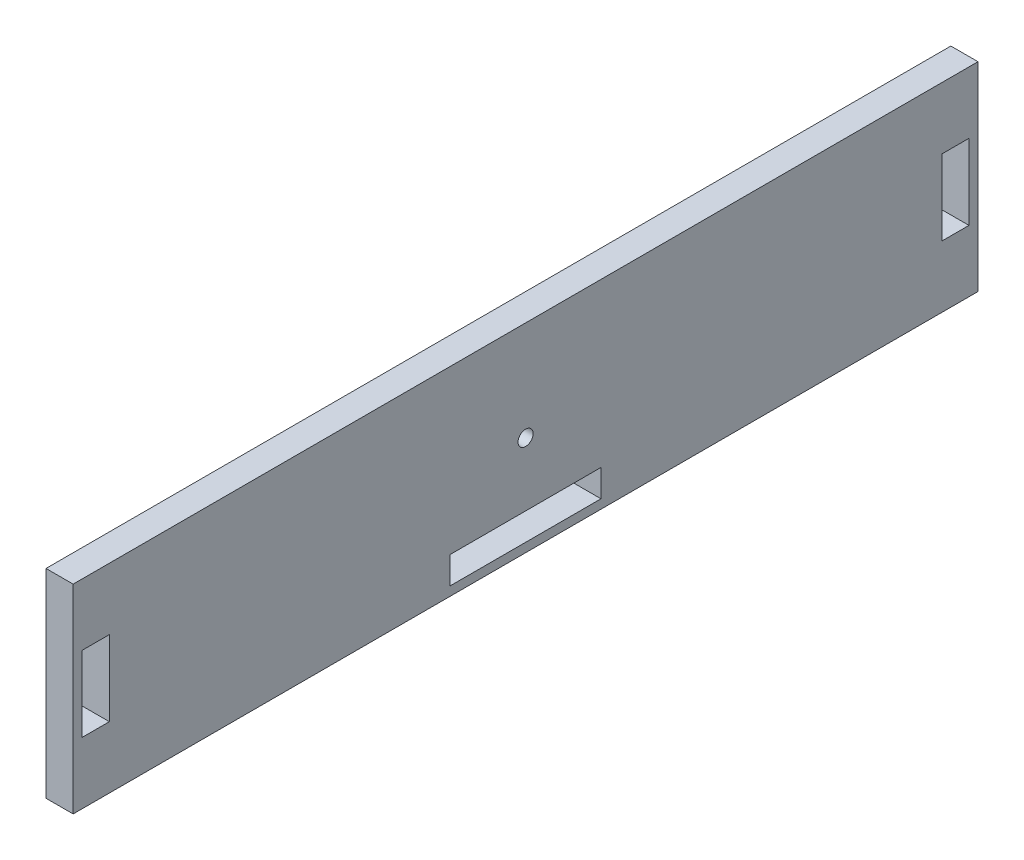
ISO-10303-21;
HEADER;
FILE_DESCRIPTION(('STEP AP214'),'2;1');
FILE_NAME('part.step','',(''),(''),'','','');
FILE_SCHEMA(('AUTOMOTIVE_DESIGN { 1 0 10303 214 1 1 1 1 }'));
ENDSEC;
DATA;
#1=APPLICATION_CONTEXT('core data for automotive mechanical design processes');
#2=APPLICATION_PROTOCOL_DEFINITION('international standard','automotive_design',2000,#1);
#3=PRODUCT_CONTEXT('',#1,'mechanical');
#4=PRODUCT('Part','Part','',(#3));
#5=PRODUCT_RELATED_PRODUCT_CATEGORY('part','',(#4));
#6=PRODUCT_DEFINITION_FORMATION('','',#4);
#7=PRODUCT_DEFINITION_CONTEXT('part definition',#1,'design');
#8=PRODUCT_DEFINITION('design','',#6,#7);
#9=PRODUCT_DEFINITION_SHAPE('','',#8);
#10=(LENGTH_UNIT() NAMED_UNIT(*) SI_UNIT(.MILLI.,.METRE.));
#11=(NAMED_UNIT(*) PLANE_ANGLE_UNIT() SI_UNIT($,.RADIAN.));
#12=(NAMED_UNIT(*) SI_UNIT($,.STERADIAN.) SOLID_ANGLE_UNIT());
#13=UNCERTAINTY_MEASURE_WITH_UNIT(LENGTH_MEASURE(1.E-05),#10,'distance_accuracy_value','');
#14=(GEOMETRIC_REPRESENTATION_CONTEXT(3) GLOBAL_UNCERTAINTY_ASSIGNED_CONTEXT((#13)) GLOBAL_UNIT_ASSIGNED_CONTEXT((#10,
#11,#12)) REPRESENTATION_CONTEXT('',''));
#15=CARTESIAN_POINT('',(0.,0.,0.));
#16=DIRECTION('',(0.,0.,1.));
#17=DIRECTION('',(1.,0.,0.));
#18=AXIS2_PLACEMENT_3D('',#15,#16,#17);
#19=CARTESIAN_POINT('',(18.,-132.,0.));
#20=DIRECTION('',(0.,1.,0.));
#21=DIRECTION('',(0.,0.,1.));
#22=AXIS2_PLACEMENT_3D('',#19,#20,#21);
#23=PLANE('',#22);
#24=DIRECTION('',(0.,0.,-1.));
#25=VECTOR('',#24,1.);
#26=CARTESIAN_POINT('',(0.,-132.,0.));
#27=LINE('',#26,#25);
#28=CARTESIAN_POINT('',(0.,-132.,0.));
#29=VERTEX_POINT('',#28);
#30=CARTESIAN_POINT('',(0.,-132.,-600.));
#31=VERTEX_POINT('',#30);
#32=EDGE_CURVE('E260',#29,#31,#27,.T.);
#33=ORIENTED_EDGE('',*,*,#32,.T.);
#34=DIRECTION('',(-1.,0.,0.));
#35=VECTOR('',#34,1.);
#36=CARTESIAN_POINT('',(18.,-132.,-600.));
#37=LINE('',#36,#35);
#38=CARTESIAN_POINT('',(18.,-132.,-600.));
#39=VERTEX_POINT('',#38);
#40=EDGE_CURVE('E11',#39,#31,#37,.T.);
#41=ORIENTED_EDGE('',*,*,#40,.F.);
#42=DIRECTION('',(0.,0.,-1.));
#43=VECTOR('',#42,1.);
#44=CARTESIAN_POINT('',(18.,-132.,0.));
#45=LINE('',#44,#43);
#46=CARTESIAN_POINT('',(18.,-132.,0.));
#47=VERTEX_POINT('',#46);
#48=EDGE_CURVE('E248',#47,#39,#45,.T.);
#49=ORIENTED_EDGE('',*,*,#48,.F.);
#50=DIRECTION('',(-1.,0.,0.));
#51=VECTOR('',#50,1.);
#52=CARTESIAN_POINT('',(18.,-132.,0.));
#53=LINE('',#52,#51);
#54=EDGE_CURVE('E259',#47,#29,#53,.T.);
#55=ORIENTED_EDGE('',*,*,#54,.T.);
#56=EDGE_LOOP('',(#33,#41,#49,#55));
#57=FACE_BOUND('',#56,.T.);
#58=ADVANCED_FACE('F33',(#57),#23,.F.);
#59=CARTESIAN_POINT('',(18.,0.,-600.));
#60=DIRECTION('',(0.,0.,-1.));
#61=DIRECTION('',(-1.,0.,0.));
#62=AXIS2_PLACEMENT_3D('',#59,#60,#61);
#63=PLANE('',#62);
#64=DIRECTION('',(0.,-1.,0.));
#65=VECTOR('',#64,1.);
#66=CARTESIAN_POINT('',(0.,0.,-600.));
#67=LINE('',#66,#65);
#68=CARTESIAN_POINT('',(0.,0.,-600.));
#69=VERTEX_POINT('',#68);
#70=EDGE_CURVE('E263',#69,#31,#67,.T.);
#71=ORIENTED_EDGE('',*,*,#70,.F.);
#72=DIRECTION('',(-1.,0.,0.));
#73=VECTOR('',#72,1.);
#74=CARTESIAN_POINT('',(18.,0.,-600.));
#75=LINE('',#74,#73);
#76=CARTESIAN_POINT('',(18.,0.,-600.));
#77=VERTEX_POINT('',#76);
#78=EDGE_CURVE('E41',#77,#69,#75,.T.);
#79=ORIENTED_EDGE('',*,*,#78,.F.);
#80=DIRECTION('',(0.,-1.,0.));
#81=VECTOR('',#80,1.);
#82=CARTESIAN_POINT('',(18.,0.,-600.));
#83=LINE('',#82,#81);
#84=EDGE_CURVE('E250',#77,#39,#83,.T.);
#85=ORIENTED_EDGE('',*,*,#84,.T.);
#86=ORIENTED_EDGE('',*,*,#40,.T.);
#87=EDGE_LOOP('',(#71,#79,#85,#86));
#88=FACE_BOUND('',#87,.T.);
#89=ADVANCED_FACE('F281',(#88),#63,.T.);
#90=CARTESIAN_POINT('',(18.,0.,0.));
#91=DIRECTION('',(0.,1.,0.));
#92=DIRECTION('',(0.,0.,1.));
#93=AXIS2_PLACEMENT_3D('',#90,#91,#92);
#94=PLANE('',#93);
#95=DIRECTION('',(0.,0.,-1.));
#96=VECTOR('',#95,1.);
#97=CARTESIAN_POINT('',(0.,0.,0.));
#98=LINE('',#97,#96);
#99=CARTESIAN_POINT('',(0.,0.,0.));
#100=VERTEX_POINT('',#99);
#101=EDGE_CURVE('E266',#100,#69,#98,.T.);
#102=ORIENTED_EDGE('',*,*,#101,.F.);
#103=DIRECTION('',(-1.,0.,0.));
#104=VECTOR('',#103,1.);
#105=CARTESIAN_POINT('',(18.,0.,0.));
#106=LINE('',#105,#104);
#107=CARTESIAN_POINT('',(18.,0.,0.));
#108=VERTEX_POINT('',#107);
#109=EDGE_CURVE('E272',#108,#100,#106,.T.);
#110=ORIENTED_EDGE('',*,*,#109,.F.);
#111=DIRECTION('',(0.,0.,-1.));
#112=VECTOR('',#111,1.);
#113=CARTESIAN_POINT('',(18.,0.,0.));
#114=LINE('',#113,#112);
#115=EDGE_CURVE('E254',#108,#77,#114,.T.);
#116=ORIENTED_EDGE('',*,*,#115,.T.);
#117=ORIENTED_EDGE('',*,*,#78,.T.);
#118=EDGE_LOOP('',(#102,#110,#116,#117));
#119=FACE_BOUND('',#118,.T.);
#120=ADVANCED_FACE('F277',(#119),#94,.T.);
#121=CARTESIAN_POINT('',(18.,0.,0.));
#122=DIRECTION('',(0.,0.,-1.));
#123=DIRECTION('',(0.,1.,0.));
#124=AXIS2_PLACEMENT_3D('',#121,#122,#123);
#125=PLANE('',#124);
#126=DIRECTION('',(0.,-1.,0.));
#127=VECTOR('',#126,1.);
#128=CARTESIAN_POINT('',(0.,0.,0.));
#129=LINE('',#128,#127);
#130=EDGE_CURVE('E251',#100,#29,#129,.T.);
#131=ORIENTED_EDGE('',*,*,#130,.T.);
#132=ORIENTED_EDGE('',*,*,#54,.F.);
#133=DIRECTION('',(0.,-1.,0.));
#134=VECTOR('',#133,1.);
#135=CARTESIAN_POINT('',(18.,0.,0.));
#136=LINE('',#135,#134);
#137=EDGE_CURVE('E257',#108,#47,#136,.T.);
#138=ORIENTED_EDGE('',*,*,#137,.F.);
#139=ORIENTED_EDGE('',*,*,#109,.T.);
#140=EDGE_LOOP('',(#131,#132,#138,#139));
#141=FACE_BOUND('',#140,.T.);
#142=ADVANCED_FACE('F288',(#141),#125,.F.);
#143=CARTESIAN_POINT('',(18.,0.,0.));
#144=DIRECTION('',(-1.,0.,0.));
#145=DIRECTION('',(0.,0.,1.));
#146=AXIS2_PLACEMENT_3D('',#143,#144,#145);
#147=PLANE('',#146);
#148=DIRECTION('',(0.,0.,1.));
#149=VECTOR('',#148,1.);
#150=CARTESIAN_POINT('',(18.,-108.,-250.));
#151=LINE('',#150,#149);
#152=CARTESIAN_POINT('',(18.,-108.,-350.));
#153=VERTEX_POINT('',#152);
#154=CARTESIAN_POINT('',(18.,-108.,-250.));
#155=VERTEX_POINT('',#154);
#156=EDGE_CURVE('E172',#153,#155,#151,.T.);
#157=ORIENTED_EDGE('',*,*,#156,.F.);
#158=DIRECTION('',(0.,1.,0.));
#159=VECTOR('',#158,1.);
#160=CARTESIAN_POINT('',(18.,-108.,-350.));
#161=LINE('',#160,#159);
#162=CARTESIAN_POINT('',(18.,-126.,-350.));
#163=VERTEX_POINT('',#162);
#164=EDGE_CURVE('E48',#163,#153,#161,.T.);
#165=ORIENTED_EDGE('',*,*,#164,.F.);
#166=DIRECTION('',(0.,0.,-1.));
#167=VECTOR('',#166,1.);
#168=CARTESIAN_POINT('',(18.,-126.,-250.));
#169=LINE('',#168,#167);
#170=CARTESIAN_POINT('',(18.,-126.,-250.));
#171=VERTEX_POINT('',#170);
#172=EDGE_CURVE('E163',#171,#163,#169,.T.);
#173=ORIENTED_EDGE('',*,*,#172,.F.);
#174=DIRECTION('',(0.,-1.,0.));
#175=VECTOR('',#174,1.);
#176=CARTESIAN_POINT('',(18.,-108.,-250.));
#177=LINE('',#176,#175);
#178=EDGE_CURVE('E166',#155,#171,#177,.T.);
#179=ORIENTED_EDGE('',*,*,#178,.F.);
#180=EDGE_LOOP('',(#157,#165,#173,#179));
#181=FACE_BOUND('',#180,.T.);
#182=DIRECTION('',(0.,0.,1.));
#183=VECTOR('',#182,1.);
#184=CARTESIAN_POINT('',(18.,-41.0000000000001,-576.));
#185=LINE('',#184,#183);
#186=CARTESIAN_POINT('',(18.,-41.0000000000001,-594.));
#187=VERTEX_POINT('',#186);
#188=CARTESIAN_POINT('',(18.,-41.0000000000001,-576.));
#189=VERTEX_POINT('',#188);
#190=EDGE_CURVE('E198',#187,#189,#185,.T.);
#191=ORIENTED_EDGE('',*,*,#190,.F.);
#192=DIRECTION('',(0.,1.,0.));
#193=VECTOR('',#192,1.);
#194=CARTESIAN_POINT('',(18.,-41.0000000000001,-594.));
#195=LINE('',#194,#193);
#196=CARTESIAN_POINT('',(18.,-91.0000000000001,-594.));
#197=VERTEX_POINT('',#196);
#198=EDGE_CURVE('E196',#197,#187,#195,.T.);
#199=ORIENTED_EDGE('',*,*,#198,.F.);
#200=DIRECTION('',(0.,0.,-1.));
#201=VECTOR('',#200,1.);
#202=CARTESIAN_POINT('',(18.,-91.0000000000001,-576.));
#203=LINE('',#202,#201);
#204=CARTESIAN_POINT('',(18.,-91.0000000000001,-576.));
#205=VERTEX_POINT('',#204);
#206=EDGE_CURVE('E186',#205,#197,#203,.T.);
#207=ORIENTED_EDGE('',*,*,#206,.F.);
#208=DIRECTION('',(0.,-1.,0.));
#209=VECTOR('',#208,1.);
#210=CARTESIAN_POINT('',(18.,-41.0000000000001,-576.));
#211=LINE('',#210,#209);
#212=EDGE_CURVE('E202',#189,#205,#211,.T.);
#213=ORIENTED_EDGE('',*,*,#212,.F.);
#214=EDGE_LOOP('',(#191,#199,#207,#213));
#215=FACE_BOUND('',#214,.T.);
#216=DIRECTION('',(0.,0.,1.));
#217=VECTOR('',#216,1.);
#218=CARTESIAN_POINT('',(18.,-41.0000000000002,-24.));
#219=LINE('',#218,#217);
#220=CARTESIAN_POINT('',(18.,-41.0000000000002,-24.));
#221=VERTEX_POINT('',#220);
#222=CARTESIAN_POINT('',(18.,-41.0000000000002,-6.00000000000001));
#223=VERTEX_POINT('',#222);
#224=EDGE_CURVE('E231',#221,#223,#219,.T.);
#225=ORIENTED_EDGE('',*,*,#224,.F.);
#226=DIRECTION('',(0.,1.,0.));
#227=VECTOR('',#226,1.);
#228=CARTESIAN_POINT('',(18.,-41.0000000000002,-24.));
#229=LINE('',#228,#227);
#230=CARTESIAN_POINT('',(18.,-91.0000000000002,-24.));
#231=VERTEX_POINT('',#230);
#232=EDGE_CURVE('E178',#231,#221,#229,.T.);
#233=ORIENTED_EDGE('',*,*,#232,.F.);
#234=DIRECTION('',(0.,0.,-1.));
#235=VECTOR('',#234,1.);
#236=CARTESIAN_POINT('',(18.,-91.0000000000002,-24.));
#237=LINE('',#236,#235);
#238=CARTESIAN_POINT('',(18.,-91.0000000000002,-6.00000000000001));
#239=VERTEX_POINT('',#238);
#240=EDGE_CURVE('E220',#239,#231,#237,.T.);
#241=ORIENTED_EDGE('',*,*,#240,.F.);
#242=DIRECTION('',(0.,-1.,0.));
#243=VECTOR('',#242,1.);
#244=CARTESIAN_POINT('',(18.,-41.0000000000002,-6.00000000000001));
#245=LINE('',#244,#243);
#246=EDGE_CURVE('E234',#223,#239,#245,.T.);
#247=ORIENTED_EDGE('',*,*,#246,.F.);
#248=EDGE_LOOP('',(#225,#233,#241,#247));
#249=FACE_BOUND('',#248,.T.);
#250=CARTESIAN_POINT('',(18.,-66.,-300.));
#251=DIRECTION('',(1.,0.,0.));
#252=DIRECTION('',(0.,0.,-1.));
#253=AXIS2_PLACEMENT_3D('',#250,#251,#252);
#254=CIRCLE('',#253,4.99999999999999);
#255=CARTESIAN_POINT('',(18.,-66.,-305.));
#256=VERTEX_POINT('',#255);
#257=EDGE_CURVE('E209',#256,#256,#254,.T.);
#258=ORIENTED_EDGE('',*,*,#257,.F.);
#259=EDGE_LOOP('',(#258));
#260=FACE_BOUND('',#259,.T.);
#261=ORIENTED_EDGE('',*,*,#48,.T.);
#262=ORIENTED_EDGE('',*,*,#84,.F.);
#263=ORIENTED_EDGE('',*,*,#115,.F.);
#264=ORIENTED_EDGE('',*,*,#137,.T.);
#265=EDGE_LOOP('',(#261,#262,#263,#264));
#266=FACE_BOUND('',#265,.T.);
#267=ADVANCED_FACE('F293',(#181,#215,#249,#260,#266),#147,.F.);
#268=CARTESIAN_POINT('',(0.,0.,0.));
#269=DIRECTION('',(-1.,0.,0.));
#270=DIRECTION('',(0.,0.,1.));
#271=AXIS2_PLACEMENT_3D('',#268,#269,#270);
#272=PLANE('',#271);
#273=DIRECTION('',(0.,1.,0.));
#274=VECTOR('',#273,1.);
#275=CARTESIAN_POINT('',(0.,-108.,-350.));
#276=LINE('',#275,#274);
#277=CARTESIAN_POINT('',(0.,-126.,-350.));
#278=VERTEX_POINT('',#277);
#279=CARTESIAN_POINT('',(0.,-108.,-350.));
#280=VERTEX_POINT('',#279);
#281=EDGE_CURVE('E147',#278,#280,#276,.T.);
#282=ORIENTED_EDGE('',*,*,#281,.T.);
#283=DIRECTION('',(0.,0.,1.));
#284=VECTOR('',#283,1.);
#285=CARTESIAN_POINT('',(0.,-108.,-250.));
#286=LINE('',#285,#284);
#287=CARTESIAN_POINT('',(0.,-108.,-250.));
#288=VERTEX_POINT('',#287);
#289=EDGE_CURVE('E156',#280,#288,#286,.T.);
#290=ORIENTED_EDGE('',*,*,#289,.T.);
#291=DIRECTION('',(0.,-1.,0.));
#292=VECTOR('',#291,1.);
#293=CARTESIAN_POINT('',(0.,-108.,-250.));
#294=LINE('',#293,#292);
#295=CARTESIAN_POINT('',(0.,-126.,-250.));
#296=VERTEX_POINT('',#295);
#297=EDGE_CURVE('E56',#288,#296,#294,.T.);
#298=ORIENTED_EDGE('',*,*,#297,.T.);
#299=DIRECTION('',(0.,0.,-1.));
#300=VECTOR('',#299,1.);
#301=CARTESIAN_POINT('',(0.,-126.,-250.));
#302=LINE('',#301,#300);
#303=EDGE_CURVE('E153',#296,#278,#302,.T.);
#304=ORIENTED_EDGE('',*,*,#303,.T.);
#305=EDGE_LOOP('',(#282,#290,#298,#304));
#306=FACE_BOUND('',#305,.T.);
#307=DIRECTION('',(0.,1.,0.));
#308=VECTOR('',#307,1.);
#309=CARTESIAN_POINT('',(0.,-41.0000000000001,-594.));
#310=LINE('',#309,#308);
#311=CARTESIAN_POINT('',(0.,-91.0000000000001,-594.));
#312=VERTEX_POINT('',#311);
#313=CARTESIAN_POINT('',(0.,-41.0000000000001,-594.));
#314=VERTEX_POINT('',#313);
#315=EDGE_CURVE('E182',#312,#314,#310,.T.);
#316=ORIENTED_EDGE('',*,*,#315,.T.);
#317=DIRECTION('',(0.,0.,1.));
#318=VECTOR('',#317,1.);
#319=CARTESIAN_POINT('',(0.,-41.0000000000001,-576.));
#320=LINE('',#319,#318);
#321=CARTESIAN_POINT('',(0.,-41.0000000000001,-576.));
#322=VERTEX_POINT('',#321);
#323=EDGE_CURVE('E185',#314,#322,#320,.T.);
#324=ORIENTED_EDGE('',*,*,#323,.T.);
#325=DIRECTION('',(0.,-1.,0.));
#326=VECTOR('',#325,1.);
#327=CARTESIAN_POINT('',(0.,-41.0000000000001,-576.));
#328=LINE('',#327,#326);
#329=CARTESIAN_POINT('',(0.,-91.0000000000001,-576.));
#330=VERTEX_POINT('',#329);
#331=EDGE_CURVE('E189',#322,#330,#328,.T.);
#332=ORIENTED_EDGE('',*,*,#331,.T.);
#333=DIRECTION('',(0.,0.,-1.));
#334=VECTOR('',#333,1.);
#335=CARTESIAN_POINT('',(0.,-91.0000000000001,-576.));
#336=LINE('',#335,#334);
#337=EDGE_CURVE('E192',#330,#312,#336,.T.);
#338=ORIENTED_EDGE('',*,*,#337,.T.);
#339=EDGE_LOOP('',(#316,#324,#332,#338));
#340=FACE_BOUND('',#339,.T.);
#341=DIRECTION('',(0.,1.,0.));
#342=VECTOR('',#341,1.);
#343=CARTESIAN_POINT('',(0.,-41.0000000000002,-24.));
#344=LINE('',#343,#342);
#345=CARTESIAN_POINT('',(0.,-91.0000000000002,-24.));
#346=VERTEX_POINT('',#345);
#347=CARTESIAN_POINT('',(0.,-41.0000000000002,-24.));
#348=VERTEX_POINT('',#347);
#349=EDGE_CURVE('E216',#346,#348,#344,.T.);
#350=ORIENTED_EDGE('',*,*,#349,.T.);
#351=DIRECTION('',(0.,0.,1.));
#352=VECTOR('',#351,1.);
#353=CARTESIAN_POINT('',(0.,-41.0000000000002,-24.));
#354=LINE('',#353,#352);
#355=CARTESIAN_POINT('',(0.,-41.0000000000002,-6.00000000000001));
#356=VERTEX_POINT('',#355);
#357=EDGE_CURVE('E219',#348,#356,#354,.T.);
#358=ORIENTED_EDGE('',*,*,#357,.T.);
#359=DIRECTION('',(0.,-1.,0.));
#360=VECTOR('',#359,1.);
#361=CARTESIAN_POINT('',(0.,-41.0000000000002,-6.00000000000001));
#362=LINE('',#361,#360);
#363=CARTESIAN_POINT('',(0.,-91.0000000000002,-6.00000000000001));
#364=VERTEX_POINT('',#363);
#365=EDGE_CURVE('E223',#356,#364,#362,.T.);
#366=ORIENTED_EDGE('',*,*,#365,.T.);
#367=DIRECTION('',(0.,0.,-1.));
#368=VECTOR('',#367,1.);
#369=CARTESIAN_POINT('',(0.,-91.0000000000002,-24.));
#370=LINE('',#369,#368);
#371=EDGE_CURVE('E226',#364,#346,#370,.T.);
#372=ORIENTED_EDGE('',*,*,#371,.T.);
#373=EDGE_LOOP('',(#350,#358,#366,#372));
#374=FACE_BOUND('',#373,.T.);
#375=CARTESIAN_POINT('',(0.,-66.,-300.));
#376=DIRECTION('',(-1.,0.,0.));
#377=DIRECTION('',(0.,0.,1.));
#378=AXIS2_PLACEMENT_3D('',#375,#376,#377);
#379=CIRCLE('',#378,4.99999999999999);
#380=CARTESIAN_POINT('',(0.,-66.,-295.));
#381=VERTEX_POINT('',#380);
#382=EDGE_CURVE('E36',#381,#381,#379,.T.);
#383=ORIENTED_EDGE('',*,*,#382,.F.);
#384=EDGE_LOOP('',(#383));
#385=FACE_BOUND('',#384,.T.);
#386=ORIENTED_EDGE('',*,*,#32,.F.);
#387=ORIENTED_EDGE('',*,*,#130,.F.);
#388=ORIENTED_EDGE('',*,*,#101,.T.);
#389=ORIENTED_EDGE('',*,*,#70,.T.);
#390=EDGE_LOOP('',(#386,#387,#388,#389));
#391=FACE_BOUND('',#390,.T.);
#392=ADVANCED_FACE('F160',(#306,#340,#374,#385,#391),#272,.T.);
#393=CARTESIAN_POINT('',(-566.,-66.,-300.));
#394=DIRECTION('',(1.,0.,0.));
#395=DIRECTION('',(0.,0.,-1.));
#396=AXIS2_PLACEMENT_3D('',#393,#394,#395);
#397=CYLINDRICAL_SURFACE('',#396,4.99999999999999);
#398=ORIENTED_EDGE('',*,*,#382,.T.);
#399=EDGE_LOOP('',(#398));
#400=FACE_BOUND('',#399,.T.);
#401=ORIENTED_EDGE('',*,*,#257,.T.);
#402=EDGE_LOOP('',(#401));
#403=FACE_BOUND('',#402,.T.);
#404=ADVANCED_FACE('F301',(#400,#403),#397,.F.);
#405=CARTESIAN_POINT('',(0.,-41.0000000000002,-24.));
#406=DIRECTION('',(0.,0.,-1.));
#407=DIRECTION('',(-1.,0.,0.));
#408=AXIS2_PLACEMENT_3D('',#405,#406,#407);
#409=PLANE('',#408);
#410=ORIENTED_EDGE('',*,*,#232,.T.);
#411=DIRECTION('',(1.,0.,0.));
#412=VECTOR('',#411,1.);
#413=CARTESIAN_POINT('',(0.,-41.0000000000002,-24.));
#414=LINE('',#413,#412);
#415=EDGE_CURVE('E229',#348,#221,#414,.T.);
#416=ORIENTED_EDGE('',*,*,#415,.F.);
#417=ORIENTED_EDGE('',*,*,#349,.F.);
#418=DIRECTION('',(1.,0.,0.));
#419=VECTOR('',#418,1.);
#420=CARTESIAN_POINT('',(0.,-91.0000000000002,-24.));
#421=LINE('',#420,#419);
#422=EDGE_CURVE('E199',#346,#231,#421,.T.);
#423=ORIENTED_EDGE('',*,*,#422,.T.);
#424=EDGE_LOOP('',(#410,#416,#417,#423));
#425=FACE_BOUND('',#424,.T.);
#426=ADVANCED_FACE('F330',(#425),#409,.F.);
#427=CARTESIAN_POINT('',(0.,-91.0000000000002,-24.));
#428=DIRECTION('',(0.,-1.,0.));
#429=DIRECTION('',(0.,0.,-1.));
#430=AXIS2_PLACEMENT_3D('',#427,#428,#429);
#431=PLANE('',#430);
#432=ORIENTED_EDGE('',*,*,#240,.T.);
#433=ORIENTED_EDGE('',*,*,#422,.F.);
#434=ORIENTED_EDGE('',*,*,#371,.F.);
#435=DIRECTION('',(1.,0.,0.));
#436=VECTOR('',#435,1.);
#437=CARTESIAN_POINT('',(0.,-91.0000000000002,-6.00000000000001));
#438=LINE('',#437,#436);
#439=EDGE_CURVE('E240',#364,#239,#438,.T.);
#440=ORIENTED_EDGE('',*,*,#439,.T.);
#441=EDGE_LOOP('',(#432,#433,#434,#440));
#442=FACE_BOUND('',#441,.T.);
#443=ADVANCED_FACE('F340',(#442),#431,.F.);
#444=CARTESIAN_POINT('',(0.,-41.0000000000002,-6.00000000000001));
#445=DIRECTION('',(0.,0.,1.));
#446=DIRECTION('',(1.,0.,0.));
#447=AXIS2_PLACEMENT_3D('',#444,#445,#446);
#448=PLANE('',#447);
#449=ORIENTED_EDGE('',*,*,#246,.T.);
#450=ORIENTED_EDGE('',*,*,#439,.F.);
#451=ORIENTED_EDGE('',*,*,#365,.F.);
#452=DIRECTION('',(1.,0.,0.));
#453=VECTOR('',#452,1.);
#454=CARTESIAN_POINT('',(0.,-41.0000000000002,-6.00000000000001));
#455=LINE('',#454,#453);
#456=EDGE_CURVE('E242',#356,#223,#455,.T.);
#457=ORIENTED_EDGE('',*,*,#456,.T.);
#458=EDGE_LOOP('',(#449,#450,#451,#457));
#459=FACE_BOUND('',#458,.T.);
#460=ADVANCED_FACE('F350',(#459),#448,.F.);
#461=CARTESIAN_POINT('',(0.,-41.0000000000002,-24.));
#462=DIRECTION('',(0.,1.,0.));
#463=DIRECTION('',(0.,0.,1.));
#464=AXIS2_PLACEMENT_3D('',#461,#462,#463);
#465=PLANE('',#464);
#466=ORIENTED_EDGE('',*,*,#224,.T.);
#467=ORIENTED_EDGE('',*,*,#456,.F.);
#468=ORIENTED_EDGE('',*,*,#357,.F.);
#469=ORIENTED_EDGE('',*,*,#415,.T.);
#470=EDGE_LOOP('',(#466,#467,#468,#469));
#471=FACE_BOUND('',#470,.T.);
#472=ADVANCED_FACE('F360',(#471),#465,.F.);
#473=CARTESIAN_POINT('',(0.,-41.0000000000001,-594.));
#474=DIRECTION('',(0.,0.,-1.));
#475=DIRECTION('',(-1.,0.,0.));
#476=AXIS2_PLACEMENT_3D('',#473,#474,#475);
#477=PLANE('',#476);
#478=ORIENTED_EDGE('',*,*,#198,.T.);
#479=DIRECTION('',(1.,0.,0.));
#480=VECTOR('',#479,1.);
#481=CARTESIAN_POINT('',(0.,-41.0000000000001,-594.));
#482=LINE('',#481,#480);
#483=EDGE_CURVE('E195',#314,#187,#482,.T.);
#484=ORIENTED_EDGE('',*,*,#483,.F.);
#485=ORIENTED_EDGE('',*,*,#315,.F.);
#486=DIRECTION('',(1.,0.,0.));
#487=VECTOR('',#486,1.);
#488=CARTESIAN_POINT('',(0.,-91.0000000000001,-594.));
#489=LINE('',#488,#487);
#490=EDGE_CURVE('E207',#312,#197,#489,.T.);
#491=ORIENTED_EDGE('',*,*,#490,.T.);
#492=EDGE_LOOP('',(#478,#484,#485,#491));
#493=FACE_BOUND('',#492,.T.);
#494=ADVANCED_FACE('F370',(#493),#477,.F.);
#495=CARTESIAN_POINT('',(0.,-91.0000000000001,-576.));
#496=DIRECTION('',(0.,-1.,0.));
#497=DIRECTION('',(0.,0.,-1.));
#498=AXIS2_PLACEMENT_3D('',#495,#496,#497);
#499=PLANE('',#498);
#500=ORIENTED_EDGE('',*,*,#206,.T.);
#501=ORIENTED_EDGE('',*,*,#490,.F.);
#502=ORIENTED_EDGE('',*,*,#337,.F.);
#503=DIRECTION('',(1.,0.,0.));
#504=VECTOR('',#503,1.);
#505=CARTESIAN_POINT('',(0.,-91.0000000000001,-576.));
#506=LINE('',#505,#504);
#507=EDGE_CURVE('E210',#330,#205,#506,.T.);
#508=ORIENTED_EDGE('',*,*,#507,.T.);
#509=EDGE_LOOP('',(#500,#501,#502,#508));
#510=FACE_BOUND('',#509,.T.);
#511=ADVANCED_FACE('F380',(#510),#499,.F.);
#512=CARTESIAN_POINT('',(0.,-41.0000000000001,-576.));
#513=DIRECTION('',(0.,0.,1.));
#514=DIRECTION('',(1.,0.,0.));
#515=AXIS2_PLACEMENT_3D('',#512,#513,#514);
#516=PLANE('',#515);
#517=ORIENTED_EDGE('',*,*,#212,.T.);
#518=ORIENTED_EDGE('',*,*,#507,.F.);
#519=ORIENTED_EDGE('',*,*,#331,.F.);
#520=DIRECTION('',(1.,0.,0.));
#521=VECTOR('',#520,1.);
#522=CARTESIAN_POINT('',(0.,-41.0000000000001,-576.));
#523=LINE('',#522,#521);
#524=EDGE_CURVE('E212',#322,#189,#523,.T.);
#525=ORIENTED_EDGE('',*,*,#524,.T.);
#526=EDGE_LOOP('',(#517,#518,#519,#525));
#527=FACE_BOUND('',#526,.T.);
#528=ADVANCED_FACE('F390',(#527),#516,.F.);
#529=CARTESIAN_POINT('',(0.,-41.0000000000001,-576.));
#530=DIRECTION('',(0.,1.,0.));
#531=DIRECTION('',(0.,0.,1.));
#532=AXIS2_PLACEMENT_3D('',#529,#530,#531);
#533=PLANE('',#532);
#534=ORIENTED_EDGE('',*,*,#190,.T.);
#535=ORIENTED_EDGE('',*,*,#524,.F.);
#536=ORIENTED_EDGE('',*,*,#323,.F.);
#537=ORIENTED_EDGE('',*,*,#483,.T.);
#538=EDGE_LOOP('',(#534,#535,#536,#537));
#539=FACE_BOUND('',#538,.T.);
#540=ADVANCED_FACE('F400',(#539),#533,.F.);
#541=CARTESIAN_POINT('',(0.,-108.,-350.));
#542=DIRECTION('',(0.,0.,-1.));
#543=DIRECTION('',(-1.,0.,0.));
#544=AXIS2_PLACEMENT_3D('',#541,#542,#543);
#545=PLANE('',#544);
#546=ORIENTED_EDGE('',*,*,#164,.T.);
#547=DIRECTION('',(1.,0.,0.));
#548=VECTOR('',#547,1.);
#549=CARTESIAN_POINT('',(0.,-108.,-350.));
#550=LINE('',#549,#548);
#551=EDGE_CURVE('E143',#280,#153,#550,.T.);
#552=ORIENTED_EDGE('',*,*,#551,.F.);
#553=ORIENTED_EDGE('',*,*,#281,.F.);
#554=DIRECTION('',(1.,0.,0.));
#555=VECTOR('',#554,1.);
#556=CARTESIAN_POINT('',(0.,-126.,-350.));
#557=LINE('',#556,#555);
#558=EDGE_CURVE('E176',#278,#163,#557,.T.);
#559=ORIENTED_EDGE('',*,*,#558,.T.);
#560=EDGE_LOOP('',(#546,#552,#553,#559));
#561=FACE_BOUND('',#560,.T.);
#562=ADVANCED_FACE('F145',(#561),#545,.F.);
#563=CARTESIAN_POINT('',(0.,-126.,-250.));
#564=DIRECTION('',(0.,-1.,0.));
#565=DIRECTION('',(0.,0.,-1.));
#566=AXIS2_PLACEMENT_3D('',#563,#564,#565);
#567=PLANE('',#566);
#568=ORIENTED_EDGE('',*,*,#172,.T.);
#569=ORIENTED_EDGE('',*,*,#558,.F.);
#570=ORIENTED_EDGE('',*,*,#303,.F.);
#571=DIRECTION('',(1.,0.,0.));
#572=VECTOR('',#571,1.);
#573=CARTESIAN_POINT('',(0.,-126.,-250.));
#574=LINE('',#573,#572);
#575=EDGE_CURVE('E179',#296,#171,#574,.T.);
#576=ORIENTED_EDGE('',*,*,#575,.T.);
#577=EDGE_LOOP('',(#568,#569,#570,#576));
#578=FACE_BOUND('',#577,.T.);
#579=ADVANCED_FACE('F427',(#578),#567,.F.);
#580=CARTESIAN_POINT('',(0.,-108.,-250.));
#581=DIRECTION('',(0.,0.,1.));
#582=DIRECTION('',(1.,0.,0.));
#583=AXIS2_PLACEMENT_3D('',#580,#581,#582);
#584=PLANE('',#583);
#585=ORIENTED_EDGE('',*,*,#178,.T.);
#586=ORIENTED_EDGE('',*,*,#575,.F.);
#587=ORIENTED_EDGE('',*,*,#297,.F.);
#588=DIRECTION('',(1.,0.,0.));
#589=VECTOR('',#588,1.);
#590=CARTESIAN_POINT('',(0.,-108.,-250.));
#591=LINE('',#590,#589);
#592=EDGE_CURVE('E152',#288,#155,#591,.T.);
#593=ORIENTED_EDGE('',*,*,#592,.T.);
#594=EDGE_LOOP('',(#585,#586,#587,#593));
#595=FACE_BOUND('',#594,.T.);
#596=ADVANCED_FACE('F436',(#595),#584,.F.);
#597=CARTESIAN_POINT('',(0.,-108.,-250.));
#598=DIRECTION('',(0.,1.,0.));
#599=DIRECTION('',(0.,0.,1.));
#600=AXIS2_PLACEMENT_3D('',#597,#598,#599);
#601=PLANE('',#600);
#602=ORIENTED_EDGE('',*,*,#156,.T.);
#603=ORIENTED_EDGE('',*,*,#592,.F.);
#604=ORIENTED_EDGE('',*,*,#289,.F.);
#605=ORIENTED_EDGE('',*,*,#551,.T.);
#606=EDGE_LOOP('',(#602,#603,#604,#605));
#607=FACE_BOUND('',#606,.T.);
#608=ADVANCED_FACE('F157',(#607),#601,.F.);
#609=CLOSED_SHELL('',(#58,#89,#120,#142,#267,#392,#404,#426,#443,#460,#472,#494,#511,#528,#540,
#562,#579,#596,#608));
#610=MANIFOLD_SOLID_BREP('B2',#609);
#611=ADVANCED_BREP_SHAPE_REPRESENTATION('',(#18,#610),#14);
#612=SHAPE_DEFINITION_REPRESENTATION(#9,#611);
ENDSEC;
END-ISO-10303-21;
